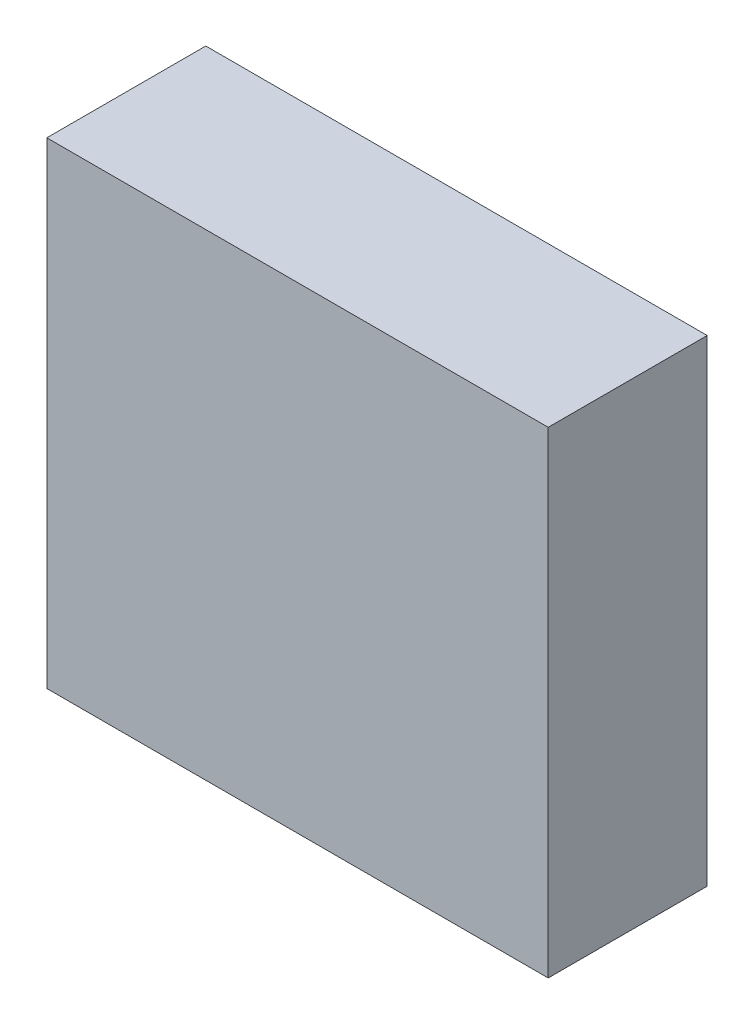
ISO-10303-21;
HEADER;
FILE_DESCRIPTION(('STEP AP214'),'2;1');
FILE_NAME('part.step','',(''),(''),'','','');
FILE_SCHEMA(('AUTOMOTIVE_DESIGN { 1 0 10303 214 1 1 1 1 }'));
ENDSEC;
DATA;
#1=APPLICATION_CONTEXT('core data for automotive mechanical design processes');
#2=APPLICATION_PROTOCOL_DEFINITION('international standard','automotive_design',2000,#1);
#3=PRODUCT_CONTEXT('',#1,'mechanical');
#4=PRODUCT('Part','Part','',(#3));
#5=PRODUCT_RELATED_PRODUCT_CATEGORY('part','',(#4));
#6=PRODUCT_DEFINITION_FORMATION('','',#4);
#7=PRODUCT_DEFINITION_CONTEXT('part definition',#1,'design');
#8=PRODUCT_DEFINITION('design','',#6,#7);
#9=PRODUCT_DEFINITION_SHAPE('','',#8);
#10=(LENGTH_UNIT() NAMED_UNIT(*) SI_UNIT(.MILLI.,.METRE.));
#11=(NAMED_UNIT(*) PLANE_ANGLE_UNIT() SI_UNIT($,.RADIAN.));
#12=(NAMED_UNIT(*) SI_UNIT($,.STERADIAN.) SOLID_ANGLE_UNIT());
#13=UNCERTAINTY_MEASURE_WITH_UNIT(LENGTH_MEASURE(1.E-05),#10,'distance_accuracy_value','');
#14=(GEOMETRIC_REPRESENTATION_CONTEXT(3) GLOBAL_UNCERTAINTY_ASSIGNED_CONTEXT((#13)) GLOBAL_UNIT_ASSIGNED_CONTEXT((#10,
#11,#12)) REPRESENTATION_CONTEXT('',''));
#15=CARTESIAN_POINT('',(0.,0.,0.));
#16=DIRECTION('',(0.,0.,1.));
#17=DIRECTION('',(1.,0.,0.));
#18=AXIS2_PLACEMENT_3D('',#15,#16,#17);
#19=CARTESIAN_POINT('',(0.,38.1,0.));
#20=DIRECTION('',(1.,0.,0.));
#21=DIRECTION('',(0.,0.,-1.));
#22=AXIS2_PLACEMENT_3D('',#19,#20,#21);
#23=PLANE('',#22);
#24=DIRECTION('',(0.,0.,1.));
#25=VECTOR('',#24,1.);
#26=CARTESIAN_POINT('',(0.,0.,0.));
#27=LINE('',#26,#25);
#28=CARTESIAN_POINT('',(0.,0.,-12.7));
#29=VERTEX_POINT('',#28);
#30=CARTESIAN_POINT('',(0.,0.,0.));
#31=VERTEX_POINT('',#30);
#32=EDGE_CURVE('E96',#29,#31,#27,.T.);
#33=ORIENTED_EDGE('',*,*,#32,.T.);
#34=DIRECTION('',(0.,-1.,0.));
#35=VECTOR('',#34,1.);
#36=CARTESIAN_POINT('',(0.,38.1,0.));
#37=LINE('',#36,#35);
#38=CARTESIAN_POINT('',(0.,38.1,0.));
#39=VERTEX_POINT('',#38);
#40=EDGE_CURVE('E11',#39,#31,#37,.T.);
#41=ORIENTED_EDGE('',*,*,#40,.F.);
#42=DIRECTION('',(0.,0.,1.));
#43=VECTOR('',#42,1.);
#44=CARTESIAN_POINT('',(0.,38.1,0.));
#45=LINE('',#44,#43);
#46=CARTESIAN_POINT('',(0.,38.1,-12.7));
#47=VERTEX_POINT('',#46);
#48=EDGE_CURVE('E84',#47,#39,#45,.T.);
#49=ORIENTED_EDGE('',*,*,#48,.F.);
#50=DIRECTION('',(0.,-1.,0.));
#51=VECTOR('',#50,1.);
#52=CARTESIAN_POINT('',(0.,38.1,-12.7));
#53=LINE('',#52,#51);
#54=EDGE_CURVE('E92',#47,#29,#53,.T.);
#55=ORIENTED_EDGE('',*,*,#54,.T.);
#56=EDGE_LOOP('',(#33,#41,#49,#55));
#57=FACE_BOUND('',#56,.T.);
#58=ADVANCED_FACE('F33',(#57),#23,.F.);
#59=CARTESIAN_POINT('',(0.,38.1,0.));
#60=DIRECTION('',(0.,0.,-1.));
#61=DIRECTION('',(-1.,0.,0.));
#62=AXIS2_PLACEMENT_3D('',#59,#60,#61);
#63=PLANE('',#62);
#64=DIRECTION('',(1.,0.,0.));
#65=VECTOR('',#64,1.);
#66=CARTESIAN_POINT('',(0.,0.,0.));
#67=LINE('',#66,#65);
#68=CARTESIAN_POINT('',(40.0558,0.,0.));
#69=VERTEX_POINT('',#68);
#70=EDGE_CURVE('E88',#31,#69,#67,.T.);
#71=ORIENTED_EDGE('',*,*,#70,.T.);
#72=DIRECTION('',(0.,-1.,0.));
#73=VECTOR('',#72,1.);
#74=CARTESIAN_POINT('',(40.0558,38.1,0.));
#75=LINE('',#74,#73);
#76=CARTESIAN_POINT('',(40.0558,38.1,0.));
#77=VERTEX_POINT('',#76);
#78=EDGE_CURVE('E41',#77,#69,#75,.T.);
#79=ORIENTED_EDGE('',*,*,#78,.F.);
#80=DIRECTION('',(1.,0.,0.));
#81=VECTOR('',#80,1.);
#82=CARTESIAN_POINT('',(0.,38.1,0.));
#83=LINE('',#82,#81);
#84=EDGE_CURVE('E79',#39,#77,#83,.T.);
#85=ORIENTED_EDGE('',*,*,#84,.F.);
#86=ORIENTED_EDGE('',*,*,#40,.T.);
#87=EDGE_LOOP('',(#71,#79,#85,#86));
#88=FACE_BOUND('',#87,.T.);
#89=ADVANCED_FACE('F87',(#88),#63,.F.);
#90=CARTESIAN_POINT('',(40.0558,38.1,0.));
#91=DIRECTION('',(-1.,0.,0.));
#92=DIRECTION('',(0.,0.,1.));
#93=AXIS2_PLACEMENT_3D('',#90,#91,#92);
#94=PLANE('',#93);
#95=DIRECTION('',(0.,0.,-1.));
#96=VECTOR('',#95,1.);
#97=CARTESIAN_POINT('',(40.0558,0.,0.));
#98=LINE('',#97,#96);
#99=CARTESIAN_POINT('',(40.0558,0.,-12.7));
#100=VERTEX_POINT('',#99);
#101=EDGE_CURVE('E66',#69,#100,#98,.T.);
#102=ORIENTED_EDGE('',*,*,#101,.T.);
#103=DIRECTION('',(0.,-1.,0.));
#104=VECTOR('',#103,1.);
#105=CARTESIAN_POINT('',(40.0558,38.1,-12.7));
#106=LINE('',#105,#104);
#107=CARTESIAN_POINT('',(40.0558,38.1,-12.7));
#108=VERTEX_POINT('',#107);
#109=EDGE_CURVE('E89',#108,#100,#106,.T.);
#110=ORIENTED_EDGE('',*,*,#109,.F.);
#111=DIRECTION('',(0.,0.,-1.));
#112=VECTOR('',#111,1.);
#113=CARTESIAN_POINT('',(40.0558,38.1,0.));
#114=LINE('',#113,#112);
#115=EDGE_CURVE('E82',#77,#108,#114,.T.);
#116=ORIENTED_EDGE('',*,*,#115,.F.);
#117=ORIENTED_EDGE('',*,*,#78,.T.);
#118=EDGE_LOOP('',(#102,#110,#116,#117));
#119=FACE_BOUND('',#118,.T.);
#120=ADVANCED_FACE('F90',(#119),#94,.F.);
#121=CARTESIAN_POINT('',(0.,38.1,-12.7));
#122=DIRECTION('',(0.,0.,1.));
#123=DIRECTION('',(1.,0.,0.));
#124=AXIS2_PLACEMENT_3D('',#121,#122,#123);
#125=PLANE('',#124);
#126=DIRECTION('',(-1.,0.,0.));
#127=VECTOR('',#126,1.);
#128=CARTESIAN_POINT('',(0.,0.,-12.7));
#129=LINE('',#128,#127);
#130=EDGE_CURVE('E72',#100,#29,#129,.T.);
#131=ORIENTED_EDGE('',*,*,#130,.T.);
#132=ORIENTED_EDGE('',*,*,#54,.F.);
#133=DIRECTION('',(-1.,0.,0.));
#134=VECTOR('',#133,1.);
#135=CARTESIAN_POINT('',(0.,38.1,-12.7));
#136=LINE('',#135,#134);
#137=EDGE_CURVE('E49',#108,#47,#136,.T.);
#138=ORIENTED_EDGE('',*,*,#137,.F.);
#139=ORIENTED_EDGE('',*,*,#109,.T.);
#140=EDGE_LOOP('',(#131,#132,#138,#139));
#141=FACE_BOUND('',#140,.T.);
#142=ADVANCED_FACE('F103',(#141),#125,.F.);
#143=CARTESIAN_POINT('',(0.,38.1,0.));
#144=DIRECTION('',(0.,-1.,0.));
#145=DIRECTION('',(0.,0.,-1.));
#146=AXIS2_PLACEMENT_3D('',#143,#144,#145);
#147=PLANE('',#146);
#148=ORIENTED_EDGE('',*,*,#48,.T.);
#149=ORIENTED_EDGE('',*,*,#84,.T.);
#150=ORIENTED_EDGE('',*,*,#115,.T.);
#151=ORIENTED_EDGE('',*,*,#137,.T.);
#152=EDGE_LOOP('',(#148,#149,#150,#151));
#153=FACE_BOUND('',#152,.T.);
#154=ADVANCED_FACE('F80',(#153),#147,.F.);
#155=CARTESIAN_POINT('',(0.,0.,0.));
#156=DIRECTION('',(0.,-1.,0.));
#157=DIRECTION('',(0.,0.,-1.));
#158=AXIS2_PLACEMENT_3D('',#155,#156,#157);
#159=PLANE('',#158);
#160=ORIENTED_EDGE('',*,*,#32,.F.);
#161=ORIENTED_EDGE('',*,*,#130,.F.);
#162=ORIENTED_EDGE('',*,*,#101,.F.);
#163=ORIENTED_EDGE('',*,*,#70,.F.);
#164=EDGE_LOOP('',(#160,#161,#162,#163));
#165=FACE_BOUND('',#164,.T.);
#166=ADVANCED_FACE('F106',(#165),#159,.T.);
#167=CLOSED_SHELL('',(#58,#89,#120,#142,#154,#166));
#168=MANIFOLD_SOLID_BREP('B2',#167);
#169=ADVANCED_BREP_SHAPE_REPRESENTATION('',(#18,#168),#14);
#170=SHAPE_DEFINITION_REPRESENTATION(#9,#169);
ENDSEC;
END-ISO-10303-21;
